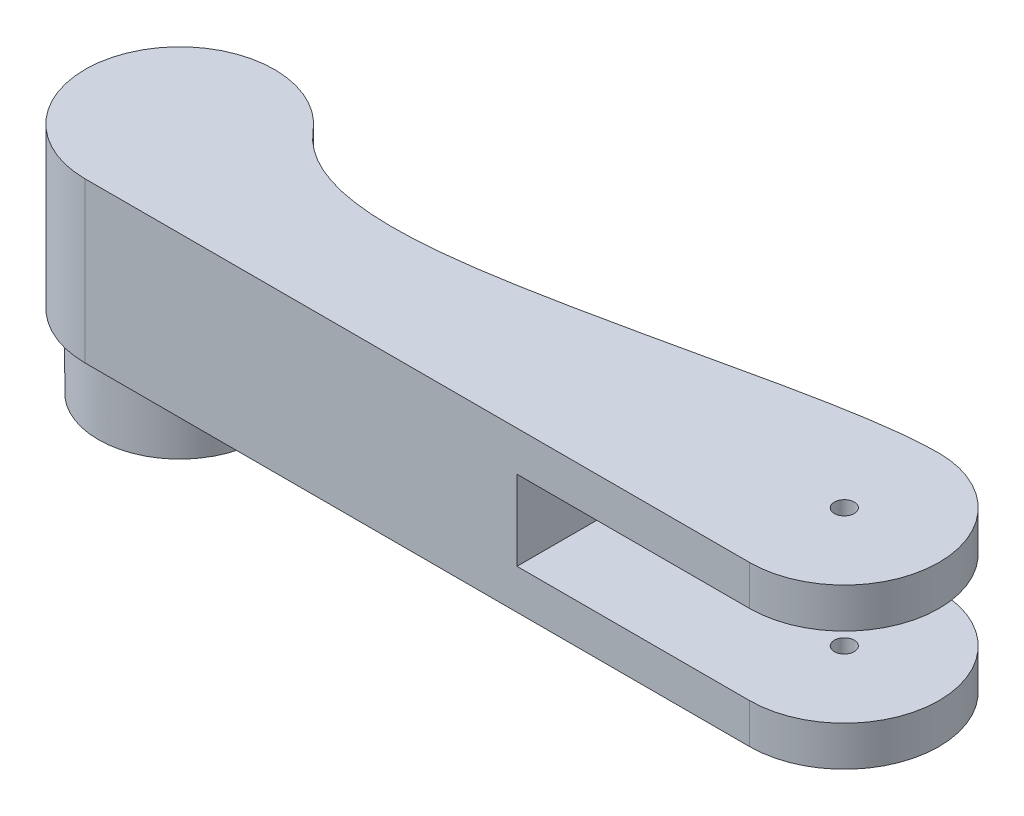
ISO-10303-21;
HEADER;
FILE_DESCRIPTION(('STEP AP214'),'2;1');
FILE_NAME('part.step','',(''),(''),'','','');
FILE_SCHEMA(('AUTOMOTIVE_DESIGN { 1 0 10303 214 1 1 1 1 }'));
ENDSEC;
DATA;
#1=APPLICATION_CONTEXT('core data for automotive mechanical design processes');
#2=APPLICATION_PROTOCOL_DEFINITION('international standard','automotive_design',2000,#1);
#3=PRODUCT_CONTEXT('',#1,'mechanical');
#4=PRODUCT('Part','Part','',(#3));
#5=PRODUCT_RELATED_PRODUCT_CATEGORY('part','',(#4));
#6=PRODUCT_DEFINITION_FORMATION('','',#4);
#7=PRODUCT_DEFINITION_CONTEXT('part definition',#1,'design');
#8=PRODUCT_DEFINITION('design','',#6,#7);
#9=PRODUCT_DEFINITION_SHAPE('','',#8);
#10=(LENGTH_UNIT() NAMED_UNIT(*) SI_UNIT(.MILLI.,.METRE.));
#11=(NAMED_UNIT(*) PLANE_ANGLE_UNIT() SI_UNIT($,.RADIAN.));
#12=(NAMED_UNIT(*) SI_UNIT($,.STERADIAN.) SOLID_ANGLE_UNIT());
#13=UNCERTAINTY_MEASURE_WITH_UNIT(LENGTH_MEASURE(1.E-05),#10,'distance_accuracy_value','');
#14=(GEOMETRIC_REPRESENTATION_CONTEXT(3) GLOBAL_UNCERTAINTY_ASSIGNED_CONTEXT((#13)) GLOBAL_UNIT_ASSIGNED_CONTEXT((#10,
#11,#12)) REPRESENTATION_CONTEXT('',''));
#15=CARTESIAN_POINT('',(0.,0.,0.));
#16=DIRECTION('',(0.,0.,1.));
#17=DIRECTION('',(1.,0.,0.));
#18=AXIS2_PLACEMENT_3D('',#15,#16,#17);
#19=CARTESIAN_POINT('',(-50.,6.,0.));
#20=DIRECTION('',(0.,1.,0.));
#21=DIRECTION('',(0.,0.,-1.));
#22=AXIS2_PLACEMENT_3D('',#19,#20,#21);
#23=PLANE('',#22);
#24=CARTESIAN_POINT('',(50.,6.,0.));
#25=DIRECTION('',(0.,1.,0.));
#26=DIRECTION('',(0.,0.,1.));
#27=AXIS2_PLACEMENT_3D('',#24,#25,#26);
#28=CIRCLE('',#27,1.5);
#29=CARTESIAN_POINT('',(50.,6.,1.50000000000002));
#30=VERTEX_POINT('',#29);
#31=EDGE_CURVE('E189',#30,#30,#28,.T.);
#32=ORIENTED_EDGE('',*,*,#31,.F.);
#33=EDGE_LOOP('',(#32));
#34=FACE_BOUND('',#33,.T.);
#35=DIRECTION('',(0.,0.,1.));
#36=VECTOR('',#35,1.);
#37=CARTESIAN_POINT('',(15.,6.,14.25));
#38=LINE('',#37,#36);
#39=CARTESIAN_POINT('',(15.,6.,-8.15498555520889));
#40=VERTEX_POINT('',#39);
#41=CARTESIAN_POINT('',(15.,6.,14.25));
#42=VERTEX_POINT('',#41);
#43=EDGE_CURVE('E184',#40,#42,#38,.T.);
#44=ORIENTED_EDGE('',*,*,#43,.T.);
#45=DIRECTION('',(-1.,0.,0.));
#46=VECTOR('',#45,1.);
#47=CARTESIAN_POINT('',(-50.,6.,14.25));
#48=LINE('',#47,#46);
#49=CARTESIAN_POINT('',(50.,6.,14.25));
#50=VERTEX_POINT('',#49);
#51=EDGE_CURVE('E196',#50,#42,#48,.T.);
#52=ORIENTED_EDGE('',*,*,#51,.F.);
#53=CARTESIAN_POINT('',(50.,6.,0.));
#54=DIRECTION('',(0.,-1.,0.));
#55=DIRECTION('',(0.,0.,-1.));
#56=AXIS2_PLACEMENT_3D('',#53,#54,#55);
#57=CIRCLE('',#56,14.25);
#58=CARTESIAN_POINT('',(50.,6.,-14.25));
#59=VERTEX_POINT('',#58);
#60=EDGE_CURVE('E194',#59,#50,#57,.T.);
#61=ORIENTED_EDGE('',*,*,#60,.F.);
#62=CARTESIAN_POINT('',(-39.0731568300049,6.,-9.1469447543063));
#63=CARTESIAN_POINT('',(-31.5140940330976,6.,-0.116968525897955));
#64=CARTESIAN_POINT('',(5.43865583696206,6.,-4.64524054337758));
#65=CARTESIAN_POINT('',(38.6975143870054,6.,-14.25));
#66=CARTESIAN_POINT('',(50.,6.,-14.25));
#67=B_SPLINE_CURVE_WITH_KNOTS('',3,(#62,#63,#64,#65,#66),.UNSPECIFIED.,.F.,.F.,(4,1,4),(0.,
0.43590790251524,1.),.UNSPECIFIED.);
#68=EDGE_CURVE('E122',#59,#40,#67,.F.);
#69=ORIENTED_EDGE('',*,*,#68,.T.);
#70=EDGE_LOOP('',(#44,#52,#61,#69));
#71=FACE_BOUND('',#70,.T.);
#72=ADVANCED_FACE('F41',(#34,#71),#23,.T.);
#73=CARTESIAN_POINT('',(-50.,0.,0.));
#74=DIRECTION('',(0.,1.,0.));
#75=DIRECTION('',(0.,0.,-1.));
#76=AXIS2_PLACEMENT_3D('',#73,#74,#75);
#77=PLANE('',#76);
#78=CARTESIAN_POINT('',(-50.,0.,0.));
#79=DIRECTION('',(0.,-1.,0.));
#80=DIRECTION('',(0.,0.,-1.));
#81=AXIS2_PLACEMENT_3D('',#78,#79,#80);
#82=CIRCLE('',#81,12.25);
#83=CARTESIAN_POINT('',(-50.,0.,-12.25));
#84=VERTEX_POINT('',#83);
#85=EDGE_CURVE('E11',#84,#84,#82,.F.);
#86=ORIENTED_EDGE('',*,*,#85,.T.);
#87=EDGE_LOOP('',(#86));
#88=FACE_BOUND('',#87,.T.);
#89=CARTESIAN_POINT('',(50.,0.,0.));
#90=DIRECTION('',(0.,1.,0.));
#91=DIRECTION('',(0.,0.,1.));
#92=AXIS2_PLACEMENT_3D('',#89,#90,#91);
#93=CIRCLE('',#92,1.5);
#94=CARTESIAN_POINT('',(50.,0.,1.50000000000002));
#95=VERTEX_POINT('',#94);
#96=EDGE_CURVE('E188',#95,#95,#93,.T.);
#97=ORIENTED_EDGE('',*,*,#96,.T.);
#98=EDGE_LOOP('',(#97));
#99=FACE_BOUND('',#98,.T.);
#100=CARTESIAN_POINT('',(-39.0731568300049,0.,-9.1469447543063));
#101=CARTESIAN_POINT('',(-31.5140940330976,0.,-0.116968525897955));
#102=CARTESIAN_POINT('',(5.43865583696206,0.,-4.64524054337758));
#103=CARTESIAN_POINT('',(38.6975143870054,0.,-14.25));
#104=CARTESIAN_POINT('',(50.,0.,-14.25));
#105=B_SPLINE_CURVE_WITH_KNOTS('',3,(#100,#101,#102,#103,#104),.UNSPECIFIED.,.F.,.F.,(4,1,4),
(0.,0.43590790251524,1.),.UNSPECIFIED.);
#106=CARTESIAN_POINT('',(50.,0.,-14.25));
#107=VERTEX_POINT('',#106);
#108=CARTESIAN_POINT('',(-39.0731568300049,0.,-9.1469447543063));
#109=VERTEX_POINT('',#108);
#110=EDGE_CURVE('E120',#107,#109,#105,.F.);
#111=ORIENTED_EDGE('',*,*,#110,.F.);
#112=CARTESIAN_POINT('',(50.,0.,0.));
#113=DIRECTION('',(0.,-1.,0.));
#114=DIRECTION('',(0.,0.,-1.));
#115=AXIS2_PLACEMENT_3D('',#112,#113,#114);
#116=CIRCLE('',#115,14.25);
#117=CARTESIAN_POINT('',(50.,0.,14.25));
#118=VERTEX_POINT('',#117);
#119=EDGE_CURVE('E126',#107,#118,#116,.T.);
#120=ORIENTED_EDGE('',*,*,#119,.T.);
#121=DIRECTION('',(-1.,0.,0.));
#122=VECTOR('',#121,1.);
#123=CARTESIAN_POINT('',(-50.,0.,14.25));
#124=LINE('',#123,#122);
#125=CARTESIAN_POINT('',(-50.,0.,14.25));
#126=VERTEX_POINT('',#125);
#127=EDGE_CURVE('E130',#118,#126,#124,.T.);
#128=ORIENTED_EDGE('',*,*,#127,.T.);
#129=CARTESIAN_POINT('',(-50.,0.,0.));
#130=DIRECTION('',(0.,-1.,0.));
#131=DIRECTION('',(0.,0.,-1.));
#132=AXIS2_PLACEMENT_3D('',#129,#130,#131);
#133=CIRCLE('',#132,14.25);
#134=EDGE_CURVE('E131',#126,#109,#133,.T.);
#135=ORIENTED_EDGE('',*,*,#134,.T.);
#136=EDGE_LOOP('',(#111,#120,#128,#135));
#137=FACE_BOUND('',#136,.T.);
#138=ADVANCED_FACE('F134',(#88,#99,#137),#77,.F.);
#139=CARTESIAN_POINT('',(15.,18.,14.25));
#140=DIRECTION('',(-1.,0.,0.));
#141=DIRECTION('',(0.,0.,-1.));
#142=AXIS2_PLACEMENT_3D('',#139,#140,#141);
#143=PLANE('',#142);
#144=DIRECTION('',(0.,1.,0.));
#145=VECTOR('',#144,1.);
#146=CARTESIAN_POINT('',(15.,-0.000999999999997531,-8.15498555520889));
#147=LINE('',#146,#145);
#148=CARTESIAN_POINT('',(15.0000000058143,18.,-8.15498555648991));
#149=VERTEX_POINT('',#148);
#150=EDGE_CURVE('E139',#149,#40,#147,.F.);
#151=ORIENTED_EDGE('',*,*,#150,.F.);
#152=DIRECTION('',(0.,0.,1.));
#153=VECTOR('',#152,1.);
#154=CARTESIAN_POINT('',(15.,18.,14.25));
#155=LINE('',#154,#153);
#156=CARTESIAN_POINT('',(15.,18.,14.25));
#157=VERTEX_POINT('',#156);
#158=EDGE_CURVE('E182',#149,#157,#155,.T.);
#159=ORIENTED_EDGE('',*,*,#158,.T.);
#160=DIRECTION('',(0.,-1.,0.));
#161=VECTOR('',#160,1.);
#162=CARTESIAN_POINT('',(15.,18.,14.25));
#163=LINE('',#162,#161);
#164=EDGE_CURVE('E81',#157,#42,#163,.T.);
#165=ORIENTED_EDGE('',*,*,#164,.T.);
#166=ORIENTED_EDGE('',*,*,#43,.F.);
#167=EDGE_LOOP('',(#151,#159,#165,#166));
#168=FACE_BOUND('',#167,.T.);
#169=ADVANCED_FACE('F217',(#168),#143,.F.);
#170=CARTESIAN_POINT('',(-50.,18.,0.));
#171=DIRECTION('',(0.,1.,0.));
#172=DIRECTION('',(0.,0.,-1.));
#173=AXIS2_PLACEMENT_3D('',#170,#171,#172);
#174=PLANE('',#173);
#175=CARTESIAN_POINT('',(50.,18.,0.));
#176=DIRECTION('',(0.,-1.,0.));
#177=DIRECTION('',(0.,0.,-1.));
#178=AXIS2_PLACEMENT_3D('',#175,#176,#177);
#179=CIRCLE('',#178,1.5);
#180=CARTESIAN_POINT('',(50.,18.,-1.49999999999999));
#181=VERTEX_POINT('',#180);
#182=EDGE_CURVE('E165',#181,#181,#179,.F.);
#183=ORIENTED_EDGE('',*,*,#182,.T.);
#184=EDGE_LOOP('',(#183));
#185=FACE_BOUND('',#184,.T.);
#186=CARTESIAN_POINT('',(-39.0731568300049,18.,-9.1469447543063));
#187=CARTESIAN_POINT('',(-31.5140940330976,18.,-0.116968525897955));
#188=CARTESIAN_POINT('',(5.43865583696206,18.,-4.64524054337758));
#189=CARTESIAN_POINT('',(38.6975143870054,18.,-14.25));
#190=CARTESIAN_POINT('',(50.,18.,-14.25));
#191=B_SPLINE_CURVE_WITH_KNOTS('',3,(#186,#187,#188,#189,#190),.UNSPECIFIED.,.F.,.F.,(4,1,4),
(0.,0.43590790251524,1.),.UNSPECIFIED.);
#192=CARTESIAN_POINT('',(50.,18.,-14.25));
#193=VERTEX_POINT('',#192);
#194=EDGE_CURVE('E136',#193,#149,#191,.F.);
#195=ORIENTED_EDGE('',*,*,#194,.F.);
#196=CARTESIAN_POINT('',(50.,18.,0.));
#197=DIRECTION('',(0.,-1.,0.));
#198=DIRECTION('',(0.,0.,-1.));
#199=AXIS2_PLACEMENT_3D('',#196,#197,#198);
#200=CIRCLE('',#199,14.25);
#201=CARTESIAN_POINT('',(50.,18.,14.25));
#202=VERTEX_POINT('',#201);
#203=EDGE_CURVE('E168',#193,#202,#200,.T.);
#204=ORIENTED_EDGE('',*,*,#203,.T.);
#205=DIRECTION('',(-1.,0.,0.));
#206=VECTOR('',#205,1.);
#207=CARTESIAN_POINT('',(-50.,18.,14.25));
#208=LINE('',#207,#206);
#209=EDGE_CURVE('E88',#202,#157,#208,.T.);
#210=ORIENTED_EDGE('',*,*,#209,.T.);
#211=ORIENTED_EDGE('',*,*,#158,.F.);
#212=EDGE_LOOP('',(#195,#204,#210,#211));
#213=FACE_BOUND('',#212,.T.);
#214=ADVANCED_FACE('F209',(#185,#213),#174,.F.);
#215=CARTESIAN_POINT('',(-50.,24.,0.));
#216=DIRECTION('',(0.,1.,0.));
#217=DIRECTION('',(0.,0.,-1.));
#218=AXIS2_PLACEMENT_3D('',#215,#216,#217);
#219=PLANE('',#218);
#220=CARTESIAN_POINT('',(50.,24.,0.));
#221=DIRECTION('',(0.,-1.,0.));
#222=DIRECTION('',(0.,0.,-1.));
#223=AXIS2_PLACEMENT_3D('',#220,#221,#222);
#224=CIRCLE('',#223,1.5);
#225=CARTESIAN_POINT('',(50.,24.,-1.49999999999999));
#226=VERTEX_POINT('',#225);
#227=EDGE_CURVE('E162',#226,#226,#224,.T.);
#228=ORIENTED_EDGE('',*,*,#227,.T.);
#229=EDGE_LOOP('',(#228));
#230=FACE_BOUND('',#229,.T.);
#231=CARTESIAN_POINT('',(-50.,24.,0.));
#232=DIRECTION('',(0.,-1.,0.));
#233=DIRECTION('',(0.,0.,-1.));
#234=AXIS2_PLACEMENT_3D('',#231,#232,#233);
#235=CIRCLE('',#234,14.25);
#236=CARTESIAN_POINT('',(-50.,24.,14.25));
#237=VERTEX_POINT('',#236);
#238=CARTESIAN_POINT('',(-39.0731568300049,24.,-9.1469447543063));
#239=VERTEX_POINT('',#238);
#240=EDGE_CURVE('E169',#237,#239,#235,.T.);
#241=ORIENTED_EDGE('',*,*,#240,.F.);
#242=DIRECTION('',(-1.,0.,0.));
#243=VECTOR('',#242,1.);
#244=CARTESIAN_POINT('',(-50.,24.,14.25));
#245=LINE('',#244,#243);
#246=CARTESIAN_POINT('',(50.,24.,14.25));
#247=VERTEX_POINT('',#246);
#248=EDGE_CURVE('E175',#247,#237,#245,.T.);
#249=ORIENTED_EDGE('',*,*,#248,.F.);
#250=CARTESIAN_POINT('',(50.,24.,0.));
#251=DIRECTION('',(0.,-1.,0.));
#252=DIRECTION('',(0.,0.,-1.));
#253=AXIS2_PLACEMENT_3D('',#250,#251,#252);
#254=CIRCLE('',#253,14.25);
#255=CARTESIAN_POINT('',(50.,24.,-14.25));
#256=VERTEX_POINT('',#255);
#257=EDGE_CURVE('E172',#256,#247,#254,.T.);
#258=ORIENTED_EDGE('',*,*,#257,.F.);
#259=CARTESIAN_POINT('',(-39.0731568300049,24.,-9.1469447543063));
#260=CARTESIAN_POINT('',(-31.5140940330976,24.,-0.116968525897955));
#261=CARTESIAN_POINT('',(5.43865583696206,24.,-4.64524054337758));
#262=CARTESIAN_POINT('',(38.6975143870054,24.,-14.25));
#263=CARTESIAN_POINT('',(50.,24.,-14.25));
#264=B_SPLINE_CURVE_WITH_KNOTS('',3,(#259,#260,#261,#262,#263),.UNSPECIFIED.,.F.,.F.,(4,1,4),
(0.,0.43590790251524,1.),.UNSPECIFIED.);
#265=EDGE_CURVE('E218',#239,#256,#264,.T.);
#266=ORIENTED_EDGE('',*,*,#265,.F.);
#267=EDGE_LOOP('',(#241,#249,#258,#266));
#268=FACE_BOUND('',#267,.T.);
#269=ADVANCED_FACE('F244',(#230,#268),#219,.T.);
#270=CARTESIAN_POINT('',(-50.,6.,0.));
#271=DIRECTION('',(0.,-1.,0.));
#272=DIRECTION('',(0.,0.,1.));
#273=AXIS2_PLACEMENT_3D('',#270,#271,#272);
#274=CYLINDRICAL_SURFACE('',#273,14.25);
#275=ORIENTED_EDGE('',*,*,#134,.F.);
#276=DIRECTION('',(0.,-1.,0.));
#277=VECTOR('',#276,1.);
#278=CARTESIAN_POINT('',(-50.,6.,14.25));
#279=LINE('',#278,#277);
#280=EDGE_CURVE('E198',#237,#126,#279,.T.);
#281=ORIENTED_EDGE('',*,*,#280,.F.);
#282=ORIENTED_EDGE('',*,*,#240,.T.);
#283=DIRECTION('',(0.,1.,0.));
#284=VECTOR('',#283,1.);
#285=CARTESIAN_POINT('',(-39.0731568300049,-0.001000000000001,-9.1469447543063));
#286=LINE('',#285,#284);
#287=EDGE_CURVE('E56',#109,#239,#286,.T.);
#288=ORIENTED_EDGE('',*,*,#287,.F.);
#289=EDGE_LOOP('',(#275,#281,#282,#288));
#290=FACE_BOUND('',#289,.T.);
#291=ADVANCED_FACE('F43',(#290),#274,.T.);
#292=CARTESIAN_POINT('',(50.,6.,0.));
#293=DIRECTION('',(0.,-1.,0.));
#294=DIRECTION('',(0.,0.,1.));
#295=AXIS2_PLACEMENT_3D('',#292,#293,#294);
#296=CYLINDRICAL_SURFACE('',#295,14.25);
#297=ORIENTED_EDGE('',*,*,#119,.F.);
#298=DIRECTION('',(0.,-1.,0.));
#299=VECTOR('',#298,1.);
#300=CARTESIAN_POINT('',(50.,6.,-14.25));
#301=LINE('',#300,#299);
#302=EDGE_CURVE('E49',#59,#107,#301,.T.);
#303=ORIENTED_EDGE('',*,*,#302,.F.);
#304=ORIENTED_EDGE('',*,*,#60,.T.);
#305=DIRECTION('',(0.,-1.,0.));
#306=VECTOR('',#305,1.);
#307=CARTESIAN_POINT('',(50.,6.,14.25));
#308=LINE('',#307,#306);
#309=EDGE_CURVE('E65',#50,#118,#308,.T.);
#310=ORIENTED_EDGE('',*,*,#309,.T.);
#311=EDGE_LOOP('',(#297,#303,#304,#310));
#312=FACE_BOUND('',#311,.T.);
#313=ADVANCED_FACE('F127',(#312),#296,.T.);
#314=CARTESIAN_POINT('',(-50.,6.,14.25));
#315=DIRECTION('',(0.,0.,-1.));
#316=DIRECTION('',(1.,0.,0.));
#317=AXIS2_PLACEMENT_3D('',#314,#315,#316);
#318=PLANE('',#317);
#319=ORIENTED_EDGE('',*,*,#127,.F.);
#320=ORIENTED_EDGE('',*,*,#309,.F.);
#321=ORIENTED_EDGE('',*,*,#51,.T.);
#322=ORIENTED_EDGE('',*,*,#164,.F.);
#323=ORIENTED_EDGE('',*,*,#209,.F.);
#324=DIRECTION('',(0.,-1.,0.));
#325=VECTOR('',#324,1.);
#326=CARTESIAN_POINT('',(50.,24.,14.25));
#327=LINE('',#326,#325);
#328=EDGE_CURVE('E178',#247,#202,#327,.T.);
#329=ORIENTED_EDGE('',*,*,#328,.F.);
#330=ORIENTED_EDGE('',*,*,#248,.T.);
#331=ORIENTED_EDGE('',*,*,#280,.T.);
#332=EDGE_LOOP('',(#319,#320,#321,#322,#323,#329,#330,#331));
#333=FACE_BOUND('',#332,.T.);
#334=ADVANCED_FACE('F214',(#333),#318,.F.);
#335=CARTESIAN_POINT('',(50.,6.,0.));
#336=DIRECTION('',(0.,-1.,0.));
#337=DIRECTION('',(0.,0.,1.));
#338=AXIS2_PLACEMENT_3D('',#335,#336,#337);
#339=CYLINDRICAL_SURFACE('',#338,1.5);
#340=ORIENTED_EDGE('',*,*,#31,.T.);
#341=EDGE_LOOP('',(#340));
#342=FACE_BOUND('',#341,.T.);
#343=ORIENTED_EDGE('',*,*,#96,.F.);
#344=EDGE_LOOP('',(#343));
#345=FACE_BOUND('',#344,.T.);
#346=ADVANCED_FACE('F253',(#342,#345),#339,.F.);
#347=CARTESIAN_POINT('',(50.,24.,0.));
#348=DIRECTION('',(0.,-1.,0.));
#349=DIRECTION('',(0.,0.,1.));
#350=AXIS2_PLACEMENT_3D('',#347,#348,#349);
#351=CYLINDRICAL_SURFACE('',#350,14.25);
#352=ORIENTED_EDGE('',*,*,#203,.F.);
#353=DIRECTION('',(0.,-1.,0.));
#354=VECTOR('',#353,1.);
#355=CARTESIAN_POINT('',(50.,24.,-14.25));
#356=LINE('',#355,#354);
#357=EDGE_CURVE('E181',#256,#193,#356,.T.);
#358=ORIENTED_EDGE('',*,*,#357,.F.);
#359=ORIENTED_EDGE('',*,*,#257,.T.);
#360=ORIENTED_EDGE('',*,*,#328,.T.);
#361=EDGE_LOOP('',(#352,#358,#359,#360));
#362=FACE_BOUND('',#361,.T.);
#363=ADVANCED_FACE('F211',(#362),#351,.T.);
#364=CARTESIAN_POINT('',(50.,-0.001000000000001,0.));
#365=DIRECTION('',(0.,1.,0.));
#366=DIRECTION('',(0.,0.,-1.));
#367=AXIS2_PLACEMENT_3D('',#364,#365,#366);
#368=CYLINDRICAL_SURFACE('',#367,1.5);
#369=CARTESIAN_POINT('',(50.,24.,-1.49999999999999));
#370=CARTESIAN_POINT('',(50.,23.9375,-1.49999999999999));
#371=CARTESIAN_POINT('',(50.,23.875,-1.49999999999999));
#372=CARTESIAN_POINT('',(50.,23.75,-1.49999999999999));
#373=CARTESIAN_POINT('',(50.,23.6875,-1.49999999999999));
#374=CARTESIAN_POINT('',(50.,23.5625,-1.49999999999999));
#375=CARTESIAN_POINT('',(50.,23.5,-1.49999999999999));
#376=CARTESIAN_POINT('',(50.,23.375,-1.49999999999999));
#377=CARTESIAN_POINT('',(50.,23.3125,-1.49999999999999));
#378=CARTESIAN_POINT('',(50.,23.1875,-1.49999999999999));
#379=CARTESIAN_POINT('',(50.,23.125,-1.49999999999999));
#380=CARTESIAN_POINT('',(50.,23.,-1.49999999999999));
#381=CARTESIAN_POINT('',(50.,22.9375,-1.49999999999999));
#382=CARTESIAN_POINT('',(50.,22.8125,-1.49999999999999));
#383=CARTESIAN_POINT('',(50.,22.75,-1.49999999999999));
#384=CARTESIAN_POINT('',(50.,22.625,-1.49999999999999));
#385=CARTESIAN_POINT('',(50.,22.5625,-1.49999999999999));
#386=CARTESIAN_POINT('',(50.,22.4375,-1.49999999999999));
#387=CARTESIAN_POINT('',(50.,22.375,-1.49999999999999));
#388=CARTESIAN_POINT('',(50.,22.25,-1.49999999999999));
#389=CARTESIAN_POINT('',(50.,22.1875,-1.49999999999999));
#390=CARTESIAN_POINT('',(50.,22.0625,-1.49999999999999));
#391=CARTESIAN_POINT('',(50.,22.,-1.49999999999999));
#392=CARTESIAN_POINT('',(50.,21.875,-1.49999999999999));
#393=CARTESIAN_POINT('',(50.,21.8125,-1.49999999999999));
#394=CARTESIAN_POINT('',(50.,21.6875,-1.49999999999999));
#395=CARTESIAN_POINT('',(50.,21.625,-1.49999999999999));
#396=CARTESIAN_POINT('',(50.,21.5,-1.49999999999999));
#397=CARTESIAN_POINT('',(50.,21.4375,-1.49999999999999));
#398=CARTESIAN_POINT('',(50.,21.3125,-1.49999999999999));
#399=CARTESIAN_POINT('',(50.,21.25,-1.49999999999999));
#400=CARTESIAN_POINT('',(50.,21.125,-1.49999999999999));
#401=CARTESIAN_POINT('',(50.,21.0625,-1.49999999999999));
#402=CARTESIAN_POINT('',(50.,20.9375,-1.49999999999999));
#403=CARTESIAN_POINT('',(50.,20.875,-1.49999999999999));
#404=CARTESIAN_POINT('',(50.,20.75,-1.49999999999999));
#405=CARTESIAN_POINT('',(50.,20.6875,-1.49999999999999));
#406=CARTESIAN_POINT('',(50.,20.5625,-1.49999999999999));
#407=CARTESIAN_POINT('',(50.,20.5,-1.49999999999999));
#408=CARTESIAN_POINT('',(50.,20.375,-1.49999999999999));
#409=CARTESIAN_POINT('',(50.,20.3125,-1.49999999999999));
#410=CARTESIAN_POINT('',(50.,20.1875,-1.49999999999999));
#411=CARTESIAN_POINT('',(50.,20.125,-1.49999999999999));
#412=CARTESIAN_POINT('',(50.,20.,-1.49999999999999));
#413=CARTESIAN_POINT('',(50.,19.9375,-1.49999999999999));
#414=CARTESIAN_POINT('',(50.,19.8125,-1.49999999999999));
#415=CARTESIAN_POINT('',(50.,19.75,-1.49999999999999));
#416=CARTESIAN_POINT('',(50.,19.625,-1.49999999999999));
#417=CARTESIAN_POINT('',(50.,19.5625,-1.49999999999999));
#418=CARTESIAN_POINT('',(50.,19.4375,-1.49999999999999));
#419=CARTESIAN_POINT('',(50.,19.375,-1.49999999999999));
#420=CARTESIAN_POINT('',(50.,19.25,-1.49999999999999));
#421=CARTESIAN_POINT('',(50.,19.1875,-1.49999999999999));
#422=CARTESIAN_POINT('',(50.,19.0625,-1.49999999999999));
#423=CARTESIAN_POINT('',(50.,19.,-1.49999999999999));
#424=CARTESIAN_POINT('',(50.,18.875,-1.49999999999999));
#425=CARTESIAN_POINT('',(50.,18.8125,-1.49999999999999));
#426=CARTESIAN_POINT('',(50.,18.6875,-1.49999999999999));
#427=CARTESIAN_POINT('',(50.,18.625,-1.49999999999999));
#428=CARTESIAN_POINT('',(50.,18.5,-1.49999999999999));
#429=CARTESIAN_POINT('',(50.,18.4375,-1.49999999999999));
#430=CARTESIAN_POINT('',(50.,18.3125,-1.49999999999999));
#431=CARTESIAN_POINT('',(50.,18.25,-1.49999999999999));
#432=CARTESIAN_POINT('',(50.,18.125,-1.49999999999999));
#433=CARTESIAN_POINT('',(50.,18.0625,-1.49999999999999));
#434=CARTESIAN_POINT('',(50.,18.,-1.49999999999999));
#435=B_SPLINE_CURVE_WITH_KNOTS('',3,(#369,#370,#371,#372,#373,#374,#375,#376,#377,#378,#379,
#380,#381,#382,#383,#384,#385,#386,#387,#388,#389,#390,#391,#392,#393,#394,#395,#396,#397,#398,
#399,#400,#401,#402,#403,#404,#405,#406,#407,#408,#409,#410,#411,#412,#413,#414,#415,#416,#417,
#418,#419,#420,#421,#422,#423,#424,#425,#426,#427,#428,#429,#430,#431,#432,#433,#434),
.UNSPECIFIED.,.F.,.F.,(4,2,2,2,2,2,2,2,2,2,2,2,2,2,2,2,2,2,2,2,2,2,2,2,2,2,2,2,2,2,2,2,4),(0.,
0.1875,0.375,0.5625,0.750000000000001,0.937500000000001,1.125,1.3125,1.5,1.6875,1.875,2.0625,
2.25,2.4375,2.625,2.8125,3.,3.1875,3.375,3.5625,3.75,3.9375,4.125,4.3125,4.5,4.6875,4.875,
5.0625,5.25,5.4375,5.625,5.8125,6.),.UNSPECIFIED.);
#436=EDGE_CURVE('BSEAM239',#226,#181,#435,.T.);
#437=ORIENTED_EDGE('',*,*,#227,.F.);
#438=ORIENTED_EDGE('',*,*,#182,.F.);
#439=ORIENTED_EDGE('',*,*,#436,.T.);
#440=ORIENTED_EDGE('',*,*,#436,.F.);
#441=EDGE_LOOP('',(#437,#439,#438,#440));
#442=FACE_BOUND('',#441,.T.);
#443=ADVANCED_FACE('F239',(#442),#368,.F.);
#444=CARTESIAN_POINT('',(-39.0731568300049,-0.000999999999997531,-9.1469447543063));
#445=CARTESIAN_POINT('',(-31.5140940330976,-0.000999999999997531,-0.116968525897955));
#446=CARTESIAN_POINT('',(5.43865583696206,-0.000999999999997531,-4.64524054337758));
#447=CARTESIAN_POINT('',(38.6975143870054,-0.000999999999997531,-14.25));
#448=CARTESIAN_POINT('',(50.,-0.000999999999997531,-14.25));
#449=B_SPLINE_CURVE_WITH_KNOTS('',3,(#444,#445,#446,#447,#448),.UNSPECIFIED.,.F.,.F.,(4,1,4),
(0.,0.43590790251524,1.),.UNSPECIFIED.);
#450=DIRECTION('',(0.,1.,0.));
#451=VECTOR('',#450,1.);
#452=SURFACE_OF_LINEAR_EXTRUSION('',#449,#451);
#453=ORIENTED_EDGE('',*,*,#302,.T.);
#454=ORIENTED_EDGE('',*,*,#110,.T.);
#455=ORIENTED_EDGE('',*,*,#287,.T.);
#456=ORIENTED_EDGE('',*,*,#265,.T.);
#457=ORIENTED_EDGE('',*,*,#357,.T.);
#458=ORIENTED_EDGE('',*,*,#194,.T.);
#459=ORIENTED_EDGE('',*,*,#150,.T.);
#460=ORIENTED_EDGE('',*,*,#68,.F.);
#461=EDGE_LOOP('',(#453,#454,#455,#456,#457,#458,#459,#460));
#462=FACE_BOUND('',#461,.T.);
#463=ADVANCED_FACE('F118',(#462),#452,.F.);
#464=CARTESIAN_POINT('',(-50.,-11.,0.));
#465=DIRECTION('',(0.,1.,0.));
#466=DIRECTION('',(0.,0.,-1.));
#467=AXIS2_PLACEMENT_3D('',#464,#465,#466);
#468=CYLINDRICAL_SURFACE('',#467,12.25);
#469=CARTESIAN_POINT('',(-50.,-11.,0.));
#470=DIRECTION('',(0.,1.,0.));
#471=DIRECTION('',(0.,0.,1.));
#472=AXIS2_PLACEMENT_3D('',#469,#470,#471);
#473=CIRCLE('',#472,12.25);
#474=CARTESIAN_POINT('',(-50.,-11.,12.25));
#475=VERTEX_POINT('',#474);
#476=EDGE_CURVE('E137',#475,#475,#473,.T.);
#477=ORIENTED_EDGE('',*,*,#476,.T.);
#478=EDGE_LOOP('',(#477));
#479=FACE_BOUND('',#478,.T.);
#480=ORIENTED_EDGE('',*,*,#85,.F.);
#481=EDGE_LOOP('',(#480));
#482=FACE_BOUND('',#481,.T.);
#483=ADVANCED_FACE('F238',(#479,#482),#468,.T.);
#484=CARTESIAN_POINT('',(-50.,-11.,0.));
#485=DIRECTION('',(0.,-1.,0.));
#486=DIRECTION('',(0.,0.,1.));
#487=AXIS2_PLACEMENT_3D('',#484,#485,#486);
#488=PLANE('',#487);
#489=CARTESIAN_POINT('',(-50.,-11.,-7.5));
#490=DIRECTION('',(0.,1.,0.));
#491=DIRECTION('',(0.,0.,1.));
#492=AXIS2_PLACEMENT_3D('',#489,#490,#491);
#493=CIRCLE('',#492,2.49999999999999);
#494=CARTESIAN_POINT('',(-50.,-11.,-5.));
#495=VERTEX_POINT('',#494);
#496=EDGE_CURVE('E433',#495,#495,#493,.T.);
#497=ORIENTED_EDGE('',*,*,#496,.T.);
#498=EDGE_LOOP('',(#497));
#499=FACE_BOUND('',#498,.T.);
#500=CARTESIAN_POINT('',(-50.,-11.,7.5));
#501=DIRECTION('',(0.,1.,0.));
#502=DIRECTION('',(0.,0.,1.));
#503=AXIS2_PLACEMENT_3D('',#500,#501,#502);
#504=CIRCLE('',#503,2.49999999999999);
#505=CARTESIAN_POINT('',(-50.,-11.,9.99999999999999));
#506=VERTEX_POINT('',#505);
#507=EDGE_CURVE('E436',#506,#506,#504,.T.);
#508=ORIENTED_EDGE('',*,*,#507,.T.);
#509=EDGE_LOOP('',(#508));
#510=FACE_BOUND('',#509,.T.);
#511=CARTESIAN_POINT('',(-50.,-11.,0.));
#512=DIRECTION('',(0.,1.,0.));
#513=DIRECTION('',(0.,0.,1.));
#514=AXIS2_PLACEMENT_3D('',#511,#512,#513);
#515=CIRCLE('',#514,3.);
#516=CARTESIAN_POINT('',(-50.,-11.,3.));
#517=VERTEX_POINT('',#516);
#518=EDGE_CURVE('E444',#517,#517,#515,.T.);
#519=ORIENTED_EDGE('',*,*,#518,.T.);
#520=EDGE_LOOP('',(#519));
#521=FACE_BOUND('',#520,.T.);
#522=ORIENTED_EDGE('',*,*,#476,.F.);
#523=EDGE_LOOP('',(#522));
#524=FACE_BOUND('',#523,.T.);
#525=ADVANCED_FACE('F329',(#499,#510,#521,#524),#488,.T.);
#526=CARTESIAN_POINT('',(-50.,-5.,0.));
#527=DIRECTION('',(0.,-1.,0.));
#528=DIRECTION('',(0.,0.,1.));
#529=AXIS2_PLACEMENT_3D('',#526,#527,#528);
#530=CYLINDRICAL_SURFACE('',#529,3.);
#531=CARTESIAN_POINT('',(-50.,-5.,0.));
#532=DIRECTION('',(0.,1.,0.));
#533=DIRECTION('',(0.,0.,1.));
#534=AXIS2_PLACEMENT_3D('',#531,#532,#533);
#535=CIRCLE('',#534,3.);
#536=CARTESIAN_POINT('',(-50.,-5.,3.));
#537=VERTEX_POINT('',#536);
#538=EDGE_CURVE('E446',#537,#537,#535,.T.);
#539=ORIENTED_EDGE('',*,*,#538,.T.);
#540=EDGE_LOOP('',(#539));
#541=FACE_BOUND('',#540,.T.);
#542=ORIENTED_EDGE('',*,*,#518,.F.);
#543=EDGE_LOOP('',(#542));
#544=FACE_BOUND('',#543,.T.);
#545=ADVANCED_FACE('F338',(#541,#544),#530,.F.);
#546=CARTESIAN_POINT('',(-50.,-5.,0.));
#547=DIRECTION('',(0.,-1.,0.));
#548=DIRECTION('',(0.,0.,1.));
#549=AXIS2_PLACEMENT_3D('',#546,#547,#548);
#550=PLANE('',#549);
#551=ORIENTED_EDGE('',*,*,#538,.F.);
#552=EDGE_LOOP('',(#551));
#553=FACE_BOUND('',#552,.T.);
#554=ADVANCED_FACE('F346',(#553),#550,.T.);
#555=CARTESIAN_POINT('',(-50.,-5.,7.5));
#556=DIRECTION('',(0.,-1.,0.));
#557=DIRECTION('',(0.,0.,1.));
#558=AXIS2_PLACEMENT_3D('',#555,#556,#557);
#559=CYLINDRICAL_SURFACE('',#558,2.49999999999999);
#560=CARTESIAN_POINT('',(-50.,-5.,7.5));
#561=DIRECTION('',(0.,1.,0.));
#562=DIRECTION('',(0.,0.,1.));
#563=AXIS2_PLACEMENT_3D('',#560,#561,#562);
#564=CIRCLE('',#563,2.49999999999999);
#565=CARTESIAN_POINT('',(-50.,-5.,9.99999999999999));
#566=VERTEX_POINT('',#565);
#567=EDGE_CURVE('E441',#566,#566,#564,.T.);
#568=ORIENTED_EDGE('',*,*,#567,.T.);
#569=EDGE_LOOP('',(#568));
#570=FACE_BOUND('',#569,.T.);
#571=ORIENTED_EDGE('',*,*,#507,.F.);
#572=EDGE_LOOP('',(#571));
#573=FACE_BOUND('',#572,.T.);
#574=ADVANCED_FACE('F355',(#570,#573),#559,.F.);
#575=CARTESIAN_POINT('',(-50.,-5.,7.5));
#576=DIRECTION('',(0.,-1.,0.));
#577=DIRECTION('',(0.,0.,1.));
#578=AXIS2_PLACEMENT_3D('',#575,#576,#577);
#579=PLANE('',#578);
#580=ORIENTED_EDGE('',*,*,#567,.F.);
#581=EDGE_LOOP('',(#580));
#582=FACE_BOUND('',#581,.T.);
#583=ADVANCED_FACE('F364',(#582),#579,.T.);
#584=CARTESIAN_POINT('',(-50.,-5.,-7.5));
#585=DIRECTION('',(0.,-1.,0.));
#586=DIRECTION('',(0.,0.,1.));
#587=AXIS2_PLACEMENT_3D('',#584,#585,#586);
#588=CYLINDRICAL_SURFACE('',#587,2.49999999999999);
#589=CARTESIAN_POINT('',(-50.,-5.,-7.5));
#590=DIRECTION('',(0.,1.,0.));
#591=DIRECTION('',(0.,0.,1.));
#592=AXIS2_PLACEMENT_3D('',#589,#590,#591);
#593=CIRCLE('',#592,2.49999999999999);
#594=CARTESIAN_POINT('',(-50.,-5.,-5.));
#595=VERTEX_POINT('',#594);
#596=EDGE_CURVE('E142',#595,#595,#593,.T.);
#597=ORIENTED_EDGE('',*,*,#596,.T.);
#598=EDGE_LOOP('',(#597));
#599=FACE_BOUND('',#598,.T.);
#600=ORIENTED_EDGE('',*,*,#496,.F.);
#601=EDGE_LOOP('',(#600));
#602=FACE_BOUND('',#601,.T.);
#603=ADVANCED_FACE('F373',(#599,#602),#588,.F.);
#604=CARTESIAN_POINT('',(-50.,-5.,-7.5));
#605=DIRECTION('',(0.,-1.,0.));
#606=DIRECTION('',(0.,0.,1.));
#607=AXIS2_PLACEMENT_3D('',#604,#605,#606);
#608=PLANE('',#607);
#609=ORIENTED_EDGE('',*,*,#596,.F.);
#610=EDGE_LOOP('',(#609));
#611=FACE_BOUND('',#610,.T.);
#612=ADVANCED_FACE('F382',(#611),#608,.T.);
#613=CLOSED_SHELL('',(#72,#138,#169,#214,#269,#291,#313,#334,#346,#363,#443,#463,#483,#525,#545,
#554,#574,#583,#603,#612));
#614=MANIFOLD_SOLID_BREP('B2',#613);
#615=ADVANCED_BREP_SHAPE_REPRESENTATION('',(#18,#614),#14);
#616=SHAPE_DEFINITION_REPRESENTATION(#9,#615);
ENDSEC;
END-ISO-10303-21;
